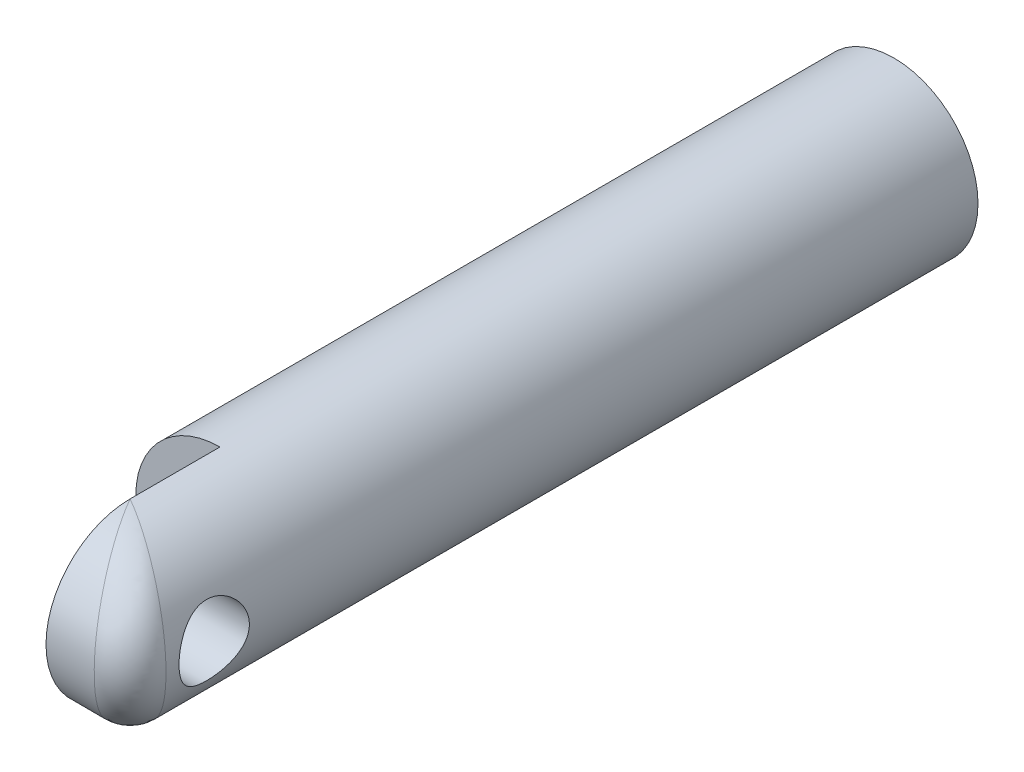
ISO-10303-21;
HEADER;
FILE_DESCRIPTION(('STEP AP214'),'2;1');
FILE_NAME('part.step','',(''),(''),'','','');
FILE_SCHEMA(('AUTOMOTIVE_DESIGN { 1 0 10303 214 1 1 1 1 }'));
ENDSEC;
DATA;
#1=APPLICATION_CONTEXT('core data for automotive mechanical design processes');
#2=APPLICATION_PROTOCOL_DEFINITION('international standard','automotive_design',2000,#1);
#3=PRODUCT_CONTEXT('',#1,'mechanical');
#4=PRODUCT('Part','Part','',(#3));
#5=PRODUCT_RELATED_PRODUCT_CATEGORY('part','',(#4));
#6=PRODUCT_DEFINITION_FORMATION('','',#4);
#7=PRODUCT_DEFINITION_CONTEXT('part definition',#1,'design');
#8=PRODUCT_DEFINITION('design','',#6,#7);
#9=PRODUCT_DEFINITION_SHAPE('','',#8);
#10=(LENGTH_UNIT() NAMED_UNIT(*) SI_UNIT(.MILLI.,.METRE.));
#11=(NAMED_UNIT(*) PLANE_ANGLE_UNIT() SI_UNIT($,.RADIAN.));
#12=(NAMED_UNIT(*) SI_UNIT($,.STERADIAN.) SOLID_ANGLE_UNIT());
#13=UNCERTAINTY_MEASURE_WITH_UNIT(LENGTH_MEASURE(1.E-05),#10,'distance_accuracy_value','');
#14=(GEOMETRIC_REPRESENTATION_CONTEXT(3) GLOBAL_UNCERTAINTY_ASSIGNED_CONTEXT((#13)) GLOBAL_UNIT_ASSIGNED_CONTEXT((#10,
#11,#12)) REPRESENTATION_CONTEXT('',''));
#15=CARTESIAN_POINT('',(0.,0.,0.));
#16=DIRECTION('',(0.,0.,1.));
#17=DIRECTION('',(1.,0.,0.));
#18=AXIS2_PLACEMENT_3D('',#15,#16,#17);
#19=CARTESIAN_POINT('',(0.,0.,133.66));
#20=DIRECTION('',(0.,0.,-1.));
#21=DIRECTION('',(-1.,0.,0.));
#22=AXIS2_PLACEMENT_3D('',#19,#20,#21);
#23=CYLINDRICAL_SURFACE('',#22,5.95190652778342);
#24=CARTESIAN_POINT('',(5.95190652778342,0.,130.197260902031));
#25=CARTESIAN_POINT('',(5.95190274737296,0.133280928944357,130.197256120182));
#26=CARTESIAN_POINT('',(5.94737892991891,0.266791266874333,130.186493375557));
#27=CARTESIAN_POINT('',(5.92973629818395,0.530014554384932,130.143848510654));
#28=CARTESIAN_POINT('',(5.91659514811359,0.659716718070394,130.111911505133));
#29=CARTESIAN_POINT('',(5.88312113851657,0.911098675990721,130.028294620244));
#30=CARTESIAN_POINT('',(5.86281273244941,1.0328040995028,129.976681823908));
#31=CARTESIAN_POINT('',(5.81698175992345,1.26570973904725,129.855459388841));
#32=CARTESIAN_POINT('',(5.79146075175407,1.37691308014563,129.785855126949));
#33=CARTESIAN_POINT('',(5.7363141624705,1.59145282102329,129.626912609043));
#34=CARTESIAN_POINT('',(5.70655351164315,1.6941893295979,129.536811882376));
#35=CARTESIAN_POINT('',(5.64686526223999,1.88360991394745,129.341046704584));
#36=CARTESIAN_POINT('',(5.61693758376302,1.9702854794886,129.235374055277));
#37=CARTESIAN_POINT('',(5.55864051991493,2.12937760192903,129.005104934352));
#38=CARTESIAN_POINT('',(5.53042229893788,2.20087243348604,128.879829354235));
#39=CARTESIAN_POINT('',(5.48088317955034,2.32150712749352,128.617679551835));
#40=CARTESIAN_POINT('',(5.4595587035059,2.37065859083704,128.480811392426));
#41=CARTESIAN_POINT('',(5.42768445469007,2.44272937514549,128.206266771269));
#42=CARTESIAN_POINT('',(5.41666291594201,2.4668037442869,128.068950415165));
#43=CARTESIAN_POINT('',(5.40528703423339,2.49164001513934,127.791818901643));
#44=CARTESIAN_POINT('',(5.40492674546417,2.49241491103505,127.652005180552));
#45=CARTESIAN_POINT('',(5.41451511039167,2.47149975315388,127.385392612016));
#46=CARTESIAN_POINT('',(5.42366863966874,2.45154247276515,127.258423474737));
#47=CARTESIAN_POINT('',(5.44990872203064,2.39263760870515,127.009836069785));
#48=CARTESIAN_POINT('',(5.46699680766116,2.35368635630842,126.888218840794));
#49=CARTESIAN_POINT('',(5.50756734370795,2.25713866792309,126.65070459395));
#50=CARTESIAN_POINT('',(5.53117854885713,2.1991618396377,126.534985185058));
#51=CARTESIAN_POINT('',(5.58210551832367,2.06647791272471,126.314465409719));
#52=CARTESIAN_POINT('',(5.60942274798979,1.99176418874059,126.209669391471));
#53=CARTESIAN_POINT('',(5.66751502337658,1.82025520514021,126.004573685448));
#54=CARTESIAN_POINT('',(5.69838637766267,1.72212094469662,125.905417812845));
#55=CARTESIAN_POINT('',(5.75814607790367,1.51031302267234,125.724585218646));
#56=CARTESIAN_POINT('',(5.78703395135337,1.39663567757507,125.642912652182));
#57=CARTESIAN_POINT('',(5.84042195481866,1.15347051852467,125.49767065589));
#58=CARTESIAN_POINT('',(5.86480353526061,1.02367487780414,125.43456978368));
#59=CARTESIAN_POINT('',(5.90552055184666,0.754030441547581,125.331500839236));
#60=CARTESIAN_POINT('',(5.9218604680048,0.6141872933604,125.29151988471));
#61=CARTESIAN_POINT('',(5.94381426903795,0.337973363951709,125.238227375698));
#62=CARTESIAN_POINT('',(5.95004437890789,0.201947638087363,125.223381010036));
#63=CARTESIAN_POINT('',(5.95304602493604,-0.0707831954568546,125.216199272095));
#64=CARTESIAN_POINT('',(5.94982030238092,-0.207488094770528,125.223857375675));
#65=CARTESIAN_POINT('',(5.93467199244865,-0.470487475779689,125.260371343505));
#66=CARTESIAN_POINT('',(5.92319300765359,-0.596960464082987,125.288146481959));
#67=CARTESIAN_POINT('',(5.89316775413534,-0.843311598229049,125.362598786932));
#68=CARTESIAN_POINT('',(5.8746205942074,-0.963188910260903,125.409278337099));
#69=CARTESIAN_POINT('',(5.83151865348366,-1.19715437544726,125.521738488141));
#70=CARTESIAN_POINT('',(5.80679500515147,-1.31094662237635,125.588067881076));
#71=CARTESIAN_POINT('',(5.75397496728998,-1.52619329717096,125.737342234431));
#72=CARTESIAN_POINT('',(5.72587716704968,-1.62764252856571,125.820294154382));
#73=CARTESIAN_POINT('',(5.66683484236051,-1.82299930964956,126.007442340001));
#74=CARTESIAN_POINT('',(5.63583098125738,-1.9158385276288,126.112737931304));
#75=CARTESIAN_POINT('',(5.5762789545783,-2.08283075951586,126.337903210414));
#76=CARTESIAN_POINT('',(5.54773136321291,-2.1569794118417,126.457776290328));
#77=CARTESIAN_POINT('',(5.49612420210101,-2.28531967511731,126.711234497182));
#78=CARTESIAN_POINT('',(5.47315149463248,-2.33920182651428,126.844995319255));
#79=CARTESIAN_POINT('',(5.43648341501489,-2.42321681662429,127.120954849867));
#80=CARTESIAN_POINT('',(5.42278031754686,-2.45336943502963,127.263146424422));
#81=CARTESIAN_POINT('',(5.40738871218188,-2.4870968407042,127.540067666129));
#82=CARTESIAN_POINT('',(5.40485204871121,-2.49254881994331,127.674522581039));
#83=CARTESIAN_POINT('',(5.4098242459674,-2.48173926004919,127.942353362573));
#84=CARTESIAN_POINT('',(5.41733153674539,-2.46548111437962,128.075729394558));
#85=CARTESIAN_POINT('',(5.44076808955945,-2.41329356553407,128.331120693633));
#86=CARTESIAN_POINT('',(5.45628268950544,-2.37832984171967,128.453374991511));
#87=CARTESIAN_POINT('',(5.49365750859677,-2.29067164867475,128.690308136176));
#88=CARTESIAN_POINT('',(5.51551951330863,-2.23797218960099,128.804984840179));
#89=CARTESIAN_POINT('',(5.56476231459994,-2.11267531496761,129.031066143433));
#90=CARTESIAN_POINT('',(5.59239662629357,-2.03906861897183,129.141855128262));
#91=CARTESIAN_POINT('',(5.64936815840448,-1.87545431272505,129.350096469068));
#92=CARTESIAN_POINT('',(5.67870597385878,-1.78544094782307,129.447544124496));
#93=CARTESIAN_POINT('',(5.73837241184244,-1.58370429994448,129.633717457594));
#94=CARTESIAN_POINT('',(5.7686150186121,-1.47087072159522,129.721273207127));
#95=CARTESIAN_POINT('',(5.824516548613,-1.23099265610158,129.876271441686));
#96=CARTESIAN_POINT('',(5.85017338333391,-1.10394173653124,129.943704771617));
#97=CARTESIAN_POINT('',(5.89364596284005,-0.841174493225646,130.055095623267));
#98=CARTESIAN_POINT('',(5.91158268907911,-0.705633150623902,130.09941784922));
#99=CARTESIAN_POINT('',(5.93809538856187,-0.42834013909527,130.164234734765));
#100=CARTESIAN_POINT('',(5.9467006257858,-0.286609343681044,130.184803898309));
#101=CARTESIAN_POINT('',(5.95074015414481,-0.120291842273973,130.194470089281));
#102=CARTESIAN_POINT('',(5.95117689564348,-0.0962493769538173,130.195515804675));
#103=CARTESIAN_POINT('',(5.95176042435423,-0.0481404360127967,130.196911644044));
#104=CARTESIAN_POINT('',(5.95190721062269,-0.0240739603140481,130.197261765755));
#105=CARTESIAN_POINT('',(5.95190652778342,0.,130.197260902031));
#106=B_SPLINE_CURVE_WITH_KNOTS('',3,(#24,#25,#26,#27,#28,#29,#30,#31,#32,#33,#34,#35,#36,#37,
#38,#39,#40,#41,#42,#43,#44,#45,#46,#47,#48,#49,#50,#51,#52,#53,#54,#55,#56,#57,#58,#59,#60,#61,
#62,#63,#64,#65,#66,#67,#68,#69,#70,#71,#72,#73,#74,#75,#76,#77,#78,#79,#80,#81,#82,#83,#84,#85,
#86,#87,#88,#89,#90,#91,#92,#93,#94,#95,#96,#97,#98,#99,#100,#101,#102,#103,#104,#105),
.UNSPECIFIED.,.T.,.F.,(4,2,2,2,2,2,2,2,2,2,2,2,2,2,2,2,2,2,2,2,2,2,2,2,2,2,2,2,2,2,2,2,2,2,2,2,
2,2,2,2,4),(0.,0.39974305896235,0.800526353633174,1.19995525664712,1.59926492608294,
2.01700248315725,2.4349607583741,2.87367248387775,3.31215616510765,3.72940594914852,
4.14642302744026,4.53118857967906,4.91602847964489,5.30908635410859,5.70230009766971,
6.129015816293,6.55583283704838,6.99264172853781,7.42920699739508,7.83799945973598,
8.2466734230978,8.6348821968903,9.02313993495167,9.42347005118649,9.82396812942529,
10.2532915415528,10.6827150469239,11.1184524019922,11.5538261634498,11.9554879874108,
12.3570870358109,12.7397121365475,13.1224449766904,13.5282863937859,13.9342704349445,
14.3701370227368,14.8062016153789,15.2351590740398,15.662767376857,15.7349710094065,
15.8071748769327),.UNSPECIFIED.);
#107=CARTESIAN_POINT('',(5.95190652778342,0.,130.197260902031));
#108=VERTEX_POINT('',#107);
#109=EDGE_CURVE('E115',#108,#108,#106,.T.);
#110=ORIENTED_EDGE('',*,*,#109,.T.);
#111=EDGE_LOOP('',(#110));
#112=FACE_BOUND('',#111,.T.);
#113=CARTESIAN_POINT('',(0.,0.,73.66));
#114=DIRECTION('',(0.,0.,1.));
#115=DIRECTION('',(1.,0.,0.));
#116=AXIS2_PLACEMENT_3D('',#113,#114,#115);
#117=CIRCLE('',#116,5.95190652778342);
#118=CARTESIAN_POINT('',(5.95190652778342,0.,73.66));
#119=VERTEX_POINT('',#118);
#120=EDGE_CURVE('E113',#119,#119,#117,.T.);
#121=ORIENTED_EDGE('',*,*,#120,.T.);
#122=EDGE_LOOP('',(#121));
#123=FACE_BOUND('',#122,.T.);
#124=DIRECTION('',(0.,0.,-1.));
#125=VECTOR('',#124,1.);
#126=CARTESIAN_POINT('',(0.,5.95190652778342,133.66));
#127=LINE('',#126,#125);
#128=CARTESIAN_POINT('',(0.,5.95190652778342,121.353820485183));
#129=VERTEX_POINT('',#128);
#130=CARTESIAN_POINT('',(0.,5.95190652778342,127.708093472217));
#131=VERTEX_POINT('',#130);
#132=EDGE_CURVE('E87',#129,#131,#127,.F.);
#133=ORIENTED_EDGE('',*,*,#132,.T.);
#134=CARTESIAN_POINT('',(0.,0.,127.708093472217));
#135=DIRECTION('',(0.497327079348258,0.,-0.867563125165502));
#136=DIRECTION('',(-0.867563125165502,0.,-0.497327079348258));
#137=AXIS2_PLACEMENT_3D('',#134,#135,#136);
#138=ELLIPSE('',#137,6.86048813640852,5.95190652778342);
#139=CARTESIAN_POINT('',(0.,-5.95190652778342,127.708093472217));
#140=VERTEX_POINT('',#139);
#141=EDGE_CURVE('E12',#131,#140,#138,.T.);
#142=ORIENTED_EDGE('',*,*,#141,.T.);
#143=DIRECTION('',(0.,0.,-1.));
#144=VECTOR('',#143,1.);
#145=CARTESIAN_POINT('',(0.,-5.95190652778342,133.66));
#146=LINE('',#145,#144);
#147=CARTESIAN_POINT('',(0.,-5.95190652778342,121.353820485183));
#148=VERTEX_POINT('',#147);
#149=EDGE_CURVE('E94',#140,#148,#146,.T.);
#150=ORIENTED_EDGE('',*,*,#149,.T.);
#151=CARTESIAN_POINT('',(0.,0.,121.353820485183));
#152=DIRECTION('',(0.,0.,-1.));
#153=DIRECTION('',(-1.,0.,0.));
#154=AXIS2_PLACEMENT_3D('',#151,#152,#153);
#155=CIRCLE('',#154,5.95190652778342);
#156=EDGE_CURVE('E109',#148,#129,#155,.T.);
#157=ORIENTED_EDGE('',*,*,#156,.T.);
#158=EDGE_LOOP('',(#133,#142,#150,#157));
#159=FACE_BOUND('',#158,.T.);
#160=ADVANCED_FACE('F68',(#112,#123,#159),#23,.T.);
#161=CARTESIAN_POINT('',(0.,-9.525,121.353820485183));
#162=DIRECTION('',(1.,0.,0.));
#163=DIRECTION('',(0.,0.,-1.));
#164=AXIS2_PLACEMENT_3D('',#161,#162,#163);
#165=PLANE('',#164);
#166=CARTESIAN_POINT('',(0.,0.,127.708093472217));
#167=DIRECTION('',(-1.,0.,0.));
#168=DIRECTION('',(0.,0.,1.));
#169=AXIS2_PLACEMENT_3D('',#166,#167,#168);
#170=CIRCLE('',#169,2.48916742981407);
#171=CARTESIAN_POINT('',(0.,0.,130.197260902031));
#172=VERTEX_POINT('',#171);
#173=EDGE_CURVE('E147',#172,#172,#170,.T.);
#174=ORIENTED_EDGE('',*,*,#173,.F.);
#175=EDGE_LOOP('',(#174));
#176=FACE_BOUND('',#175,.T.);
#177=CARTESIAN_POINT('',(0.,0.,127.708093472217));
#178=DIRECTION('',(1.,0.,0.));
#179=DIRECTION('',(0.,0.,-1.));
#180=AXIS2_PLACEMENT_3D('',#177,#178,#179);
#181=CIRCLE('',#180,5.95190652778342);
#182=EDGE_CURVE('E106',#131,#140,#181,.T.);
#183=ORIENTED_EDGE('',*,*,#182,.F.);
#184=ORIENTED_EDGE('',*,*,#132,.F.);
#185=DIRECTION('',(0.,1.,0.));
#186=VECTOR('',#185,1.);
#187=CARTESIAN_POINT('',(0.,-9.525,121.353820485183));
#188=LINE('',#187,#186);
#189=EDGE_CURVE('E111',#148,#129,#188,.T.);
#190=ORIENTED_EDGE('',*,*,#189,.F.);
#191=ORIENTED_EDGE('',*,*,#149,.F.);
#192=EDGE_LOOP('',(#183,#184,#190,#191));
#193=FACE_BOUND('',#192,.T.);
#194=ADVANCED_FACE('F108',(#176,#193),#165,.F.);
#195=CARTESIAN_POINT('',(0.,0.,73.66));
#196=DIRECTION('',(0.,0.,1.));
#197=DIRECTION('',(1.,0.,0.));
#198=AXIS2_PLACEMENT_3D('',#195,#196,#197);
#199=PLANE('',#198);
#200=ORIENTED_EDGE('',*,*,#120,.F.);
#201=EDGE_LOOP('',(#200));
#202=FACE_BOUND('',#201,.T.);
#203=ADVANCED_FACE('F124',(#202),#199,.F.);
#204=CARTESIAN_POINT('',(0.,-9.525,121.353820485183));
#205=DIRECTION('',(0.,0.,-1.));
#206=DIRECTION('',(-1.,0.,0.));
#207=AXIS2_PLACEMENT_3D('',#204,#205,#206);
#208=PLANE('',#207);
#209=ORIENTED_EDGE('',*,*,#189,.T.);
#210=ORIENTED_EDGE('',*,*,#156,.F.);
#211=EDGE_LOOP('',(#209,#210));
#212=FACE_BOUND('',#211,.T.);
#213=ADVANCED_FACE('F126',(#212),#208,.F.);
#214=CARTESIAN_POINT('',(9.525,0.,127.708093472217));
#215=DIRECTION('',(-1.,0.,0.));
#216=DIRECTION('',(0.,0.,1.));
#217=AXIS2_PLACEMENT_3D('',#214,#215,#216);
#218=CYLINDRICAL_SURFACE('',#217,5.95190652778342);
#219=ORIENTED_EDGE('',*,*,#182,.T.);
#220=CARTESIAN_POINT('',(0.,0.,127.708093472217));
#221=DIRECTION('',(0.867563125165502,0.,-0.497327079348258));
#222=DIRECTION('',(-0.497327079348258,0.,-0.867563125165502));
#223=AXIS2_PLACEMENT_3D('',#220,#221,#222);
#224=ELLIPSE('',#223,6.86048813640852,5.95190652778342);
#225=EDGE_CURVE('E80',#140,#131,#224,.F.);
#226=ORIENTED_EDGE('',*,*,#225,.T.);
#227=EDGE_LOOP('',(#219,#226));
#228=FACE_BOUND('',#227,.T.);
#229=ADVANCED_FACE('F105',(#228),#218,.T.);
#230=CARTESIAN_POINT('',(9.525,0.,127.708093472217));
#231=DIRECTION('',(-1.,0.,0.));
#232=DIRECTION('',(0.,0.,1.));
#233=AXIS2_PLACEMENT_3D('',#230,#231,#232);
#234=CYLINDRICAL_SURFACE('',#233,2.48916742981407);
#235=ORIENTED_EDGE('',*,*,#173,.T.);
#236=EDGE_LOOP('',(#235));
#237=FACE_BOUND('',#236,.T.);
#238=ORIENTED_EDGE('',*,*,#109,.F.);
#239=EDGE_LOOP('',(#238));
#240=FACE_BOUND('',#239,.T.);
#241=ADVANCED_FACE('F148',(#237,#240),#234,.F.);
#242=CARTESIAN_POINT('',(0.,-5.95190652778342,127.708093472217));
#243=CARTESIAN_POINT('',(0.,-5.95190652778342,127.708093472217));
#244=CARTESIAN_POINT('',(0.,-5.95190652778342,127.708093472217));
#245=CARTESIAN_POINT('',(0.25929330266832,-5.95180220499773,127.856732317241));
#246=CARTESIAN_POINT('',(0.204004862731906,-5.95187941082371,127.912098334948));
#247=CARTESIAN_POINT('',(0.148638845024675,-5.95180220499773,127.967386774885));
#248=CARTESIAN_POINT('',(0.518652811864316,-5.93495404742091,128.005409114892));
#249=CARTESIAN_POINT('',(0.408574285508269,-5.94217261817453,128.116667757725));
#250=CARTESIAN_POINT('',(0.297315642675608,-5.93495404742091,128.226746284081));
#251=CARTESIAN_POINT('',(1.03291167845985,-5.8673089523126,128.300205946079));
#252=CARTESIAN_POINT('',(0.81591739951813,-5.9031298279522,128.524010871735));
#253=CARTESIAN_POINT('',(0.592112473861944,-5.8673089523126,128.741005150676));
#254=CARTESIAN_POINT('',(1.28783020841963,-5.81680179300539,128.446336970207));
#255=CARTESIAN_POINT('',(1.01984825636265,-5.87373919328901,128.727941728579));
#256=CARTESIAN_POINT('',(0.738243497990547,-5.81680179300538,128.995923680636));
#257=CARTESIAN_POINT('',(1.78886585826852,-5.6825342238999,128.733553645468));
#258=CARTESIAN_POINT('',(1.42532228914567,-5.79472979998687,129.133415761362));
#259=CARTESIAN_POINT('',(1.02546017325111,-5.68253422389989,129.496959330485));
#260=CARTESIAN_POINT('',(2.03505888706771,-5.59934577863656,128.874682811078));
#261=CARTESIAN_POINT('',(1.62800775280806,-5.74500477281223,129.336101225025));
#262=CARTESIAN_POINT('',(1.16658933886111,-5.59934577863656,129.743152359284));
#263=CARTESIAN_POINT('',(2.51435593259057,-5.40081924735719,129.149437918661));
#264=CARTESIAN_POINT('',(2.03049208734664,-5.62399928383819,129.738585559563));
#265=CARTESIAN_POINT('',(1.44134444644439,-5.40081924735719,130.222449404807));
#266=CARTESIAN_POINT('',(2.74763298612601,-5.28632363144169,129.283163053292));
#267=CARTESIAN_POINT('',(2.23139363539839,-5.55257252543066,129.939487107615));
#268=CARTESIAN_POINT('',(1.5750695810755,-5.28632363144168,130.455726458343));
#269=CARTESIAN_POINT('',(3.19700609229236,-5.02687675963997,129.540764382745));
#270=CARTESIAN_POINT('',(2.62979445974238,-5.38581764120046,130.337887931959));
#271=CARTESIAN_POINT('',(1.83267091052888,-5.02687675963995,130.905099564509));
#272=CARTESIAN_POINT('',(3.41341267194421,-4.88301091034843,129.664818585936));
#273=CARTESIAN_POINT('',(2.82832234626741,-5.2903293655733,130.536415818484));
#274=CARTESIAN_POINT('',(1.95672511371954,-4.88301091034842,131.121506144161));
#275=CARTESIAN_POINT('',(3.82519555108863,-4.56703764503837,129.900871468626));
#276=CARTESIAN_POINT('',(3.22115185110669,-5.07164055008254,130.929245323323));
#277=CARTESIAN_POINT('',(2.19277799640914,-4.56703764503836,131.533289023305));
#278=CARTESIAN_POINT('',(4.02105848046474,-4.39621089740063,130.013149106752));
#279=CARTESIAN_POINT('',(3.41635383506856,-4.94832178634937,131.124447307285));
#280=CARTESIAN_POINT('',(2.30505563453562,-4.39621089740064,131.729151952681));
#281=CARTESIAN_POINT('',(4.38821736107096,-4.02904723233245,130.223621461388));
#282=CARTESIAN_POINT('',(3.80076592700716,-4.66833720208687,131.508859399224));
#283=CARTESIAN_POINT('',(2.5155279891713,-4.02904723233246,132.096310833288));
#284=CARTESIAN_POINT('',(4.56020443806212,-3.83410714261215,130.322212362966));
#285=CARTESIAN_POINT('',(3.99067530292849,-4.5117001081018,131.698768775145));
#286=CARTESIAN_POINT('',(2.61411889074903,-3.83410714261215,132.268297910279));
#287=CARTESIAN_POINT('',(4.87645459297613,-3.42195087318172,130.503501494931));
#288=CARTESIAN_POINT('',(4.36070981770173,-4.15773667068763,132.068803289918));
#289=CARTESIAN_POINT('',(2.79540802271486,-3.42195087318172,132.584548065193));
#290=CARTESIAN_POINT('',(5.02161634045212,-3.20612980312901,130.586714884034));
#291=CARTESIAN_POINT('',(4.54125114539943,-3.96076379620567,132.249344617616));
#292=CARTESIAN_POINT('',(2.87862141181729,-3.20612980312901,132.729709812669));
#293=CARTESIAN_POINT('',(5.28151937742443,-2.75594227018859,130.735703256801));
#294=CARTESIAN_POINT('',(4.88530433483229,-3.51844318992504,132.593397807049));
#295=CARTESIAN_POINT('',(3.02760978458443,-2.75594227018858,132.989612849641));
#296=CARTESIAN_POINT('',(5.39732102621144,-2.52281580087072,130.802086087173));
#297=CARTESIAN_POINT('',(5.04888842499179,-3.27403555264497,132.756981897208));
#298=CARTESIAN_POINT('',(3.09399261495654,-2.52281580087072,133.105414498428));
#299=CARTESIAN_POINT('',(5.59637096119509,-2.04222725411874,130.916190663472));
#300=CARTESIAN_POINT('',(5.34730618443911,-2.73231111204957,133.055399656656));
#301=CARTESIAN_POINT('',(3.20809719125581,-2.04222725411874,133.304464433412));
#302=CARTESIAN_POINT('',(5.68072144330495,-1.79569100168699,130.964544238783));
#303=CARTESIAN_POINT('',(5.48188455876822,-2.43682821275088,133.189978030985));
#304=CARTESIAN_POINT('',(3.25645076656632,-1.79569100168699,133.388814915522));
#305=CARTESIAN_POINT('',(5.81542584379858,-1.29290601297899,131.041762995701));
#306=CARTESIAN_POINT('',(5.70712532356144,-1.7970157873691,133.415218795778));
#307=CARTESIAN_POINT('',(3.33366952348395,-1.29290601297899,133.523519316015));
#308=CARTESIAN_POINT('',(5.86672450993632,-1.03717118300512,131.071169750166));
#309=CARTESIAN_POINT('',(5.79735768627149,-1.45562406375173,133.505451158488));
#310=CARTESIAN_POINT('',(3.36307627794909,-1.03717118300512,133.574817982153));
#311=CARTESIAN_POINT('',(5.93468764132386,-0.520858707351972,131.110129342449));
#312=CARTESIAN_POINT('',(5.91991419452864,-0.740928486587992,133.628007666745));
#313=CARTESIAN_POINT('',(3.40203587023221,-0.520858707351975,133.64278111354));
#314=CARTESIAN_POINT('',(5.95190652778342,-0.260429353675986,131.12));
#315=CARTESIAN_POINT('',(5.95190652778342,-0.371545293413351,133.66));
#316=CARTESIAN_POINT('',(3.41190652778342,-0.260429353675988,133.66));
#317=CARTESIAN_POINT('',(5.95190652778342,0.260429353675985,131.12));
#318=CARTESIAN_POINT('',(5.95190652778342,0.371545293413349,133.66));
#319=CARTESIAN_POINT('',(3.41190652778342,0.260429353675986,133.66));
#320=CARTESIAN_POINT('',(5.93468764132386,0.520858707351971,131.110129342449));
#321=CARTESIAN_POINT('',(5.91991419452864,0.740928486587991,133.628007666745));
#322=CARTESIAN_POINT('',(3.40203587023221,0.520858707351973,133.64278111354));
#323=CARTESIAN_POINT('',(5.86672450993632,1.03717118300511,131.071169750166));
#324=CARTESIAN_POINT('',(5.79735768627149,1.45562406375173,133.505451158488));
#325=CARTESIAN_POINT('',(3.36307627794909,1.03717118300512,133.574817982153));
#326=CARTESIAN_POINT('',(5.81542584379858,1.29290601297899,131.041762995701));
#327=CARTESIAN_POINT('',(5.70712532356144,1.7970157873691,133.415218795778));
#328=CARTESIAN_POINT('',(3.33366952348395,1.29290601297899,133.523519316015));
#329=CARTESIAN_POINT('',(5.68072144330495,1.79569100168699,130.964544238783));
#330=CARTESIAN_POINT('',(5.48188455876822,2.43682821275088,133.189978030985));
#331=CARTESIAN_POINT('',(3.25645076656632,1.79569100168699,133.388814915522));
#332=CARTESIAN_POINT('',(5.59637096119509,2.04222725411874,130.916190663472));
#333=CARTESIAN_POINT('',(5.34730618443911,2.73231111204957,133.055399656656));
#334=CARTESIAN_POINT('',(3.20809719125581,2.04222725411874,133.304464433412));
#335=CARTESIAN_POINT('',(5.39732102621144,2.52281580087072,130.802086087173));
#336=CARTESIAN_POINT('',(5.04888842499179,3.27403555264497,132.756981897208));
#337=CARTESIAN_POINT('',(3.09399261495654,2.52281580087072,133.105414498428));
#338=CARTESIAN_POINT('',(5.28151937742443,2.75594227018859,130.735703256801));
#339=CARTESIAN_POINT('',(4.88530433483229,3.51844318992504,132.593397807049));
#340=CARTESIAN_POINT('',(3.02760978458443,2.75594227018858,132.989612849641));
#341=CARTESIAN_POINT('',(5.02161634045212,3.20612980312901,130.586714884034));
#342=CARTESIAN_POINT('',(4.54125114539943,3.96076379620567,132.249344617616));
#343=CARTESIAN_POINT('',(2.87862141181729,3.20612980312901,132.729709812669));
#344=CARTESIAN_POINT('',(4.87645459297613,3.42195087318172,130.503501494931));
#345=CARTESIAN_POINT('',(4.36070981770173,4.15773667068763,132.068803289918));
#346=CARTESIAN_POINT('',(2.79540802271486,3.42195087318172,132.584548065193));
#347=CARTESIAN_POINT('',(4.56020443806212,3.83410714261215,130.322212362966));
#348=CARTESIAN_POINT('',(3.99067530292849,4.5117001081018,131.698768775145));
#349=CARTESIAN_POINT('',(2.61411889074903,3.83410714261215,132.268297910279));
#350=CARTESIAN_POINT('',(4.38821736107097,4.02904723233245,130.223621461388));
#351=CARTESIAN_POINT('',(3.80076592700716,4.66833720208687,131.508859399224));
#352=CARTESIAN_POINT('',(2.5155279891713,4.02904723233246,132.096310833288));
#353=CARTESIAN_POINT('',(4.02105848046474,4.39621089740063,130.013149106752));
#354=CARTESIAN_POINT('',(3.41635383506856,4.94832178634937,131.124447307285));
#355=CARTESIAN_POINT('',(2.30505563453562,4.39621089740064,131.729151952681));
#356=CARTESIAN_POINT('',(3.82519555108863,4.56703764503837,129.900871468626));
#357=CARTESIAN_POINT('',(3.22115185110669,5.07164055008254,130.929245323323));
#358=CARTESIAN_POINT('',(2.19277799640914,4.56703764503836,131.533289023305));
#359=CARTESIAN_POINT('',(3.41341267194422,4.88301091034843,129.664818585936));
#360=CARTESIAN_POINT('',(2.82832234626742,5.2903293655733,130.536415818484));
#361=CARTESIAN_POINT('',(1.95672511371954,4.88301091034842,131.121506144161));
#362=CARTESIAN_POINT('',(3.19700609229236,5.02687675963996,129.540764382745));
#363=CARTESIAN_POINT('',(2.62979445974238,5.38581764120046,130.337887931959));
#364=CARTESIAN_POINT('',(1.83267091052889,5.02687675963995,130.905099564509));
#365=CARTESIAN_POINT('',(2.74763298612601,5.28632363144169,129.283163053292));
#366=CARTESIAN_POINT('',(2.23139363539839,5.55257252543066,129.939487107615));
#367=CARTESIAN_POINT('',(1.5750695810755,5.28632363144168,130.455726458343));
#368=CARTESIAN_POINT('',(2.51435593259057,5.40081924735719,129.149437918661));
#369=CARTESIAN_POINT('',(2.03049208734664,5.62399928383819,129.738585559563));
#370=CARTESIAN_POINT('',(1.44134444644439,5.40081924735719,130.222449404807));
#371=CARTESIAN_POINT('',(2.03505888706771,5.59934577863656,128.874682811078));
#372=CARTESIAN_POINT('',(1.62800775280806,5.74500477281223,129.336101225025));
#373=CARTESIAN_POINT('',(1.16658933886111,5.59934577863656,129.743152359284));
#374=CARTESIAN_POINT('',(1.78886585826851,5.6825342238999,128.733553645468));
#375=CARTESIAN_POINT('',(1.42532228914567,5.79472979998687,129.133415761362));
#376=CARTESIAN_POINT('',(1.02546017325111,5.68253422389989,129.496959330485));
#377=CARTESIAN_POINT('',(1.28783020841963,5.81680179300539,128.446336970207));
#378=CARTESIAN_POINT('',(1.01984825636265,5.87373919328901,128.727941728579));
#379=CARTESIAN_POINT('',(0.738243497990547,5.81680179300539,128.995923680636));
#380=CARTESIAN_POINT('',(1.03291167845985,5.8673089523126,128.300205946079));
#381=CARTESIAN_POINT('',(0.81591739951813,5.9031298279522,128.524010871735));
#382=CARTESIAN_POINT('',(0.592112473861944,5.8673089523126,128.741005150676));
#383=CARTESIAN_POINT('',(0.518652811864317,5.93495404742091,128.005409114892));
#384=CARTESIAN_POINT('',(0.40857428550827,5.94217261817453,128.116667757725));
#385=CARTESIAN_POINT('',(0.297315642675608,5.93495404742091,128.226746284081));
#386=CARTESIAN_POINT('',(0.259293302668321,5.95180220499773,127.856732317241));
#387=CARTESIAN_POINT('',(0.204004862731907,5.95187941082371,127.912098334948));
#388=CARTESIAN_POINT('',(0.148638845024675,5.95180220499773,127.967386774885));
#389=CARTESIAN_POINT('',(0.,5.95190652778342,127.708093472217));
#390=CARTESIAN_POINT('',(0.,5.95190652778342,127.708093472217));
#391=CARTESIAN_POINT('',(0.,5.95190652778342,127.708093472217));
#392=(BOUNDED_SURFACE() B_SPLINE_SURFACE(3,2,((#242,#243,#244),(#245,#246,#247),(#248,#249,
#250),(#251,#252,#253),(#254,#255,#256),(#257,#258,#259),(#260,#261,#262),(#263,#264,#265),
(#266,#267,#268),(#269,#270,#271),(#272,#273,#274),(#275,#276,#277),(#278,#279,#280),(#281,#282,
#283),(#284,#285,#286),(#287,#288,#289),(#290,#291,#292),(#293,#294,#295),(#296,#297,#298),
(#299,#300,#301),(#302,#303,#304),(#305,#306,#307),(#308,#309,#310),(#311,#312,#313),(#314,#315,
#316),(#317,#318,#319),(#320,#321,#322),(#323,#324,#325),(#326,#327,#328),(#329,#330,#331),
(#332,#333,#334),(#335,#336,#337),(#338,#339,#340),(#341,#342,#343),(#344,#345,#346),(#347,#348,
#349),(#350,#351,#352),(#353,#354,#355),(#356,#357,#358),(#359,#360,#361),(#362,#363,#364),
(#365,#366,#367),(#368,#369,#370),(#371,#372,#373),(#374,#375,#376),(#377,#378,#379),(#380,#381,
#382),(#383,#384,#385),(#386,#387,#388),(#389,#390,#391)),.UNSPECIFIED.,.F.,.F.,
.F.) B_SPLINE_SURFACE_WITH_KNOTS((4,2,2,2,2,2,2,2,2,2,2,2,2,2,2,2,2,2,2,2,2,2,2,2,4),(3,3),(0.,
0.630486391978468,1.25561371748392,1.87025581085197,2.46975656880606,3.05017517844911,
3.60854163597605,4.14312049880525,4.65367108303269,5.14167364725487,5.61046225476905,
6.06517478855425,6.51242703394261,6.95967927933097,7.41439181311617,7.88318042063034,
8.37118298485252,8.88173356907997,9.41631243190916,9.9746788894361,10.5550974990791,
11.1545982570332,11.7692403504013,12.3943676759067,13.0248540678852),(0.,1.),
.UNSPECIFIED.) GEOMETRIC_REPRESENTATION_ITEM() RATIONAL_B_SPLINE_SURFACE(((1.,1.,1.),(1.,
1.00000566557019,1.),(1.,0.998576699090688,1.),(1.,0.992910721279765,1.),(1.,0.988697681267574,
1.),(1.,0.977617128833049,1.),(1.,0.970795325018432,1.),(1.,0.954789124900481,1.),(1.,
0.94566706946563,1.),(1.,0.92548796875733,1.),(1.,0.914501756375306,1.),(1.,0.891169998194024,
1.),(1.,0.878891956959708,1.),(1.,0.853706993048538,1.),(1.,0.84084914596985,1.),(1.,
0.81538745442243,1.),(1.,0.802798170091792,1.),(1.,0.778880732263429,1.),(1.,0.767521437046521,
1.),(1.,0.747118526989835,1.),(1.,0.738001346912332,1.),(1.,0.723039691293394,1.),(1.,
0.717105167896984,1.),(1.,0.709170186451792,1.),(1.,0.707106781186547,1.),(1.,0.707106781186547,
1.),(1.,0.709170186451792,1.),(1.,0.717105167896984,1.),(1.,0.723039691293395,1.),(1.,
0.738001346912332,1.),(1.,0.747118526989835,1.),(1.,0.767521437046521,1.),(1.,0.778880732263429,
1.),(1.,0.802798170091792,1.),(1.,0.81538745442243,1.),(1.,0.84084914596985,1.),(1.,
0.853706993048538,1.),(1.,0.878891956959708,1.),(1.,0.891169998194024,1.),(1.,0.914501756375306,
1.),(1.,0.92548796875733,1.),(1.,0.945667069465631,1.),(1.,0.954789124900481,1.),(1.,
0.970795325018432,1.),(1.,0.977617128833049,1.),(1.,0.988697681267574,1.),(1.,0.992910721279765,
1.),(1.,0.998576699090688,1.),(1.,1.00000566557019,1.),(1.,1.,1.))) REPRESENTATION_ITEM('') SURFACE());
#393=ORIENTED_EDGE('',*,*,#225,.F.);
#394=ORIENTED_EDGE('',*,*,#141,.F.);
#395=EDGE_LOOP('',(#393,#394));
#396=FACE_BOUND('',#395,.T.);
#397=ADVANCED_FACE('F70',(#396),#392,.T.);
#398=CLOSED_SHELL('',(#160,#194,#203,#213,#229,#241,#397));
#399=MANIFOLD_SOLID_BREP('B2',#398);
#400=ADVANCED_BREP_SHAPE_REPRESENTATION('',(#18,#399),#14);
#401=SHAPE_DEFINITION_REPRESENTATION(#9,#400);
ENDSEC;
END-ISO-10303-21;
